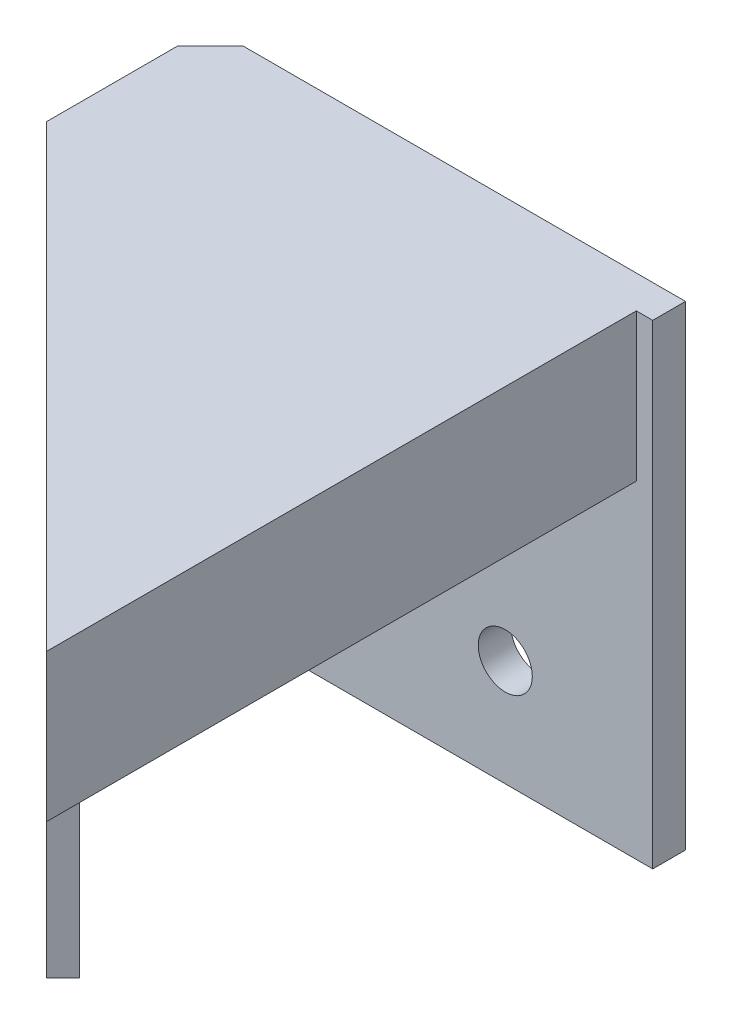
ISO-10303-21;
HEADER;
FILE_DESCRIPTION(('STEP AP214'),'2;1');
FILE_NAME('part.step','',(''),(''),'','','');
FILE_SCHEMA(('AUTOMOTIVE_DESIGN { 1 0 10303 214 1 1 1 1 }'));
ENDSEC;
DATA;
#1=APPLICATION_CONTEXT('core data for automotive mechanical design processes');
#2=APPLICATION_PROTOCOL_DEFINITION('international standard','automotive_design',2000,#1);
#3=PRODUCT_CONTEXT('',#1,'mechanical');
#4=PRODUCT('Part','Part','',(#3));
#5=PRODUCT_RELATED_PRODUCT_CATEGORY('part','',(#4));
#6=PRODUCT_DEFINITION_FORMATION('','',#4);
#7=PRODUCT_DEFINITION_CONTEXT('part definition',#1,'design');
#8=PRODUCT_DEFINITION('design','',#6,#7);
#9=PRODUCT_DEFINITION_SHAPE('','',#8);
#10=(LENGTH_UNIT() NAMED_UNIT(*) SI_UNIT(.MILLI.,.METRE.));
#11=(NAMED_UNIT(*) PLANE_ANGLE_UNIT() SI_UNIT($,.RADIAN.));
#12=(NAMED_UNIT(*) SI_UNIT($,.STERADIAN.) SOLID_ANGLE_UNIT());
#13=UNCERTAINTY_MEASURE_WITH_UNIT(LENGTH_MEASURE(1.E-05),#10,'distance_accuracy_value','');
#14=(GEOMETRIC_REPRESENTATION_CONTEXT(3) GLOBAL_UNCERTAINTY_ASSIGNED_CONTEXT((#13)) GLOBAL_UNIT_ASSIGNED_CONTEXT((#10,
#11,#12)) REPRESENTATION_CONTEXT('',''));
#15=CARTESIAN_POINT('',(0.,0.,0.));
#16=DIRECTION('',(0.,0.,1.));
#17=DIRECTION('',(1.,0.,0.));
#18=AXIS2_PLACEMENT_3D('',#15,#16,#17);
#19=CARTESIAN_POINT('',(0.,0.,0.));
#20=DIRECTION('',(0.,0.,1.));
#21=DIRECTION('',(1.,0.,0.));
#22=AXIS2_PLACEMENT_3D('',#19,#20,#21);
#23=PLANE('',#22);
#24=CARTESIAN_POINT('',(1.24992424225031,-28.95,0.));
#25=DIRECTION('',(0.,0.,1.));
#26=DIRECTION('',(1.,0.,0.));
#27=AXIS2_PLACEMENT_3D('',#24,#25,#26);
#28=CIRCLE('',#27,1.65);
#29=CARTESIAN_POINT('',(2.89992424225031,-28.95,0.));
#30=VERTEX_POINT('',#29);
#31=EDGE_CURVE('E54',#30,#30,#28,.T.);
#32=ORIENTED_EDGE('',*,*,#31,.T.);
#33=EDGE_LOOP('',(#32));
#34=FACE_BOUND('',#33,.T.);
#35=DIRECTION('',(-1.,0.,0.));
#36=VECTOR('',#35,1.);
#37=CARTESIAN_POINT('',(0.,-35.45,0.));
#38=LINE('',#37,#36);
#39=CARTESIAN_POINT('',(10.2499242422503,-35.45,0.));
#40=VERTEX_POINT('',#39);
#41=CARTESIAN_POINT('',(-16.7500757577497,-35.45,0.));
#42=VERTEX_POINT('',#41);
#43=EDGE_CURVE('E319',#40,#42,#38,.T.);
#44=ORIENTED_EDGE('',*,*,#43,.T.);
#45=DIRECTION('',(0.,1.,0.));
#46=VECTOR('',#45,1.);
#47=CARTESIAN_POINT('',(-16.7500757577497,-6.45,0.));
#48=LINE('',#47,#46);
#49=CARTESIAN_POINT('',(-16.7500757577497,-6.45,0.));
#50=VERTEX_POINT('',#49);
#51=EDGE_CURVE('E60',#42,#50,#48,.T.);
#52=ORIENTED_EDGE('',*,*,#51,.T.);
#53=DIRECTION('',(-1.,0.,0.));
#54=VECTOR('',#53,1.);
#55=CARTESIAN_POINT('',(0.,-6.45,0.));
#56=LINE('',#55,#54);
#57=CARTESIAN_POINT('',(10.2499242422503,-6.45,0.));
#58=VERTEX_POINT('',#57);
#59=EDGE_CURVE('E330',#58,#50,#56,.T.);
#60=ORIENTED_EDGE('',*,*,#59,.F.);
#61=DIRECTION('',(0.,1.,0.));
#62=VECTOR('',#61,1.);
#63=CARTESIAN_POINT('',(10.2499242422503,0.,0.));
#64=LINE('',#63,#62);
#65=EDGE_CURVE('E341',#40,#58,#64,.T.);
#66=ORIENTED_EDGE('',*,*,#65,.F.);
#67=EDGE_LOOP('',(#44,#52,#60,#66));
#68=FACE_BOUND('',#67,.T.);
#69=DIRECTION('',(0.,-1.,0.));
#70=VECTOR('',#69,1.);
#71=CARTESIAN_POINT('',(-9.85007575774969,-14.45,0.));
#72=LINE('',#71,#70);
#73=CARTESIAN_POINT('',(-9.85007575774969,-14.45,0.));
#74=VERTEX_POINT('',#73);
#75=CARTESIAN_POINT('',(-9.85007575774969,-17.35,0.));
#76=VERTEX_POINT('',#75);
#77=EDGE_CURVE('E218',#74,#76,#72,.T.);
#78=ORIENTED_EDGE('',*,*,#77,.F.);
#79=DIRECTION('',(-1.,0.,0.));
#80=VECTOR('',#79,1.);
#81=CARTESIAN_POINT('',(-14.7500757577497,-14.45,0.));
#82=LINE('',#81,#80);
#83=CARTESIAN_POINT('',(3.34992424225031,-14.45,0.));
#84=VERTEX_POINT('',#83);
#85=EDGE_CURVE('E226',#84,#74,#82,.T.);
#86=ORIENTED_EDGE('',*,*,#85,.F.);
#87=DIRECTION('',(0.,1.,0.));
#88=VECTOR('',#87,1.);
#89=CARTESIAN_POINT('',(3.34992424225031,-14.45,0.));
#90=LINE('',#89,#88);
#91=CARTESIAN_POINT('',(3.34992424225031,-17.35,0.));
#92=VERTEX_POINT('',#91);
#93=EDGE_CURVE('E484',#92,#84,#90,.T.);
#94=ORIENTED_EDGE('',*,*,#93,.F.);
#95=DIRECTION('',(-1.,0.,0.));
#96=VECTOR('',#95,1.);
#97=CARTESIAN_POINT('',(6.14992424225031,-17.35,0.));
#98=LINE('',#97,#96);
#99=CARTESIAN_POINT('',(6.14992424225031,-17.35,0.));
#100=VERTEX_POINT('',#99);
#101=EDGE_CURVE('E75',#100,#92,#98,.T.);
#102=ORIENTED_EDGE('',*,*,#101,.F.);
#103=DIRECTION('',(0.,-1.,0.));
#104=VECTOR('',#103,1.);
#105=CARTESIAN_POINT('',(6.14992424225031,-14.45,0.));
#106=LINE('',#105,#104);
#107=CARTESIAN_POINT('',(6.14992424225031,-14.45,0.));
#108=VERTEX_POINT('',#107);
#109=EDGE_CURVE('E231',#108,#100,#106,.T.);
#110=ORIENTED_EDGE('',*,*,#109,.F.);
#111=CARTESIAN_POINT('',(8.24992424225031,-14.45,0.));
#112=VERTEX_POINT('',#111);
#113=EDGE_CURVE('E239',#112,#108,#82,.T.);
#114=ORIENTED_EDGE('',*,*,#113,.F.);
#115=DIRECTION('',(0.,-1.,0.));
#116=VECTOR('',#115,1.);
#117=CARTESIAN_POINT('',(8.24992424225031,-14.45,0.));
#118=LINE('',#117,#116);
#119=CARTESIAN_POINT('',(8.24992424225031,-7.45,0.));
#120=VERTEX_POINT('',#119);
#121=EDGE_CURVE('E245',#120,#112,#118,.T.);
#122=ORIENTED_EDGE('',*,*,#121,.F.);
#123=DIRECTION('',(1.,0.,0.));
#124=VECTOR('',#123,1.);
#125=CARTESIAN_POINT('',(-14.7500757577497,-7.45,0.));
#126=LINE('',#125,#124);
#127=CARTESIAN_POINT('',(-14.7500757577497,-7.45,0.));
#128=VERTEX_POINT('',#127);
#129=EDGE_CURVE('E252',#128,#120,#126,.T.);
#130=ORIENTED_EDGE('',*,*,#129,.F.);
#131=DIRECTION('',(0.,1.,0.));
#132=VECTOR('',#131,1.);
#133=CARTESIAN_POINT('',(-14.7500757577497,-14.45,0.));
#134=LINE('',#133,#132);
#135=CARTESIAN_POINT('',(-14.7500757577497,-14.45,0.));
#136=VERTEX_POINT('',#135);
#137=EDGE_CURVE('E246',#136,#128,#134,.T.);
#138=ORIENTED_EDGE('',*,*,#137,.F.);
#139=CARTESIAN_POINT('',(-12.6500757577497,-14.45,0.));
#140=VERTEX_POINT('',#139);
#141=EDGE_CURVE('E240',#140,#136,#82,.T.);
#142=ORIENTED_EDGE('',*,*,#141,.F.);
#143=DIRECTION('',(0.,1.,0.));
#144=VECTOR('',#143,1.);
#145=CARTESIAN_POINT('',(-12.6500757577497,-14.45,0.));
#146=LINE('',#145,#144);
#147=CARTESIAN_POINT('',(-12.6500757577497,-17.35,0.));
#148=VERTEX_POINT('',#147);
#149=EDGE_CURVE('E836',#148,#140,#146,.T.);
#150=ORIENTED_EDGE('',*,*,#149,.F.);
#151=DIRECTION('',(-1.,0.,0.));
#152=VECTOR('',#151,1.);
#153=CARTESIAN_POINT('',(-9.85007575774969,-17.35,0.));
#154=LINE('',#153,#152);
#155=EDGE_CURVE('E229',#76,#148,#154,.T.);
#156=ORIENTED_EDGE('',*,*,#155,.F.);
#157=EDGE_LOOP('',(#78,#86,#94,#102,#110,#114,#122,#130,#138,#142,#150,#156));
#158=FACE_BOUND('',#157,.T.);
#159=ADVANCED_FACE('F49',(#34,#68,#158),#23,.F.);
#160=CARTESIAN_POINT('',(-2.4866197904592,17.2676497978738,26.2634559672907));
#161=DIRECTION('',(0.707106781186544,0.,0.707106781186551));
#162=DIRECTION('',(0.707106781186551,0.,-0.707106781186544));
#163=AXIS2_PLACEMENT_3D('',#160,#161,#162);
#164=PLANE('',#163);
#165=DIRECTION('',(0.707106781186551,0.,-0.707106781186544));
#166=VECTOR('',#165,1.);
#167=CARTESIAN_POINT('',(-2.48661979045919,-15.45,26.2634559672907));
#168=LINE('',#167,#166);
#169=CARTESIAN_POINT('',(-2.48661979045919,-15.45,26.2634559672907));
#170=VERTEX_POINT('',#169);
#171=CARTESIAN_POINT('',(-1.48661979045918,-15.45,25.2634559672907));
#172=VERTEX_POINT('',#171);
#173=EDGE_CURVE('E436',#170,#172,#168,.T.);
#174=ORIENTED_EDGE('',*,*,#173,.F.);
#175=DIRECTION('',(0.,-1.,0.));
#176=VECTOR('',#175,1.);
#177=CARTESIAN_POINT('',(-2.4866197904592,17.2676497978738,26.2634559672907));
#178=LINE('',#177,#176);
#179=CARTESIAN_POINT('',(-2.48661979045919,-35.45,26.2634559672907));
#180=VERTEX_POINT('',#179);
#181=EDGE_CURVE('E291',#170,#180,#178,.T.);
#182=ORIENTED_EDGE('',*,*,#181,.T.);
#183=DIRECTION('',(-0.707106781186551,0.,0.707106781186544));
#184=VECTOR('',#183,1.);
#185=CARTESIAN_POINT('',(-2.48661979045919,-35.45,26.2634559672907));
#186=LINE('',#185,#184);
#187=CARTESIAN_POINT('',(-1.48661979045918,-35.45,25.2634559672907));
#188=VERTEX_POINT('',#187);
#189=EDGE_CURVE('E295',#188,#180,#186,.T.);
#190=ORIENTED_EDGE('',*,*,#189,.F.);
#191=DIRECTION('',(0.,-1.,0.));
#192=VECTOR('',#191,1.);
#193=CARTESIAN_POINT('',(-1.48661979045918,17.2676497978738,25.2634559672907));
#194=LINE('',#193,#192);
#195=EDGE_CURVE('E303',#172,#188,#194,.T.);
#196=ORIENTED_EDGE('',*,*,#195,.F.);
#197=EDGE_LOOP('',(#174,#182,#190,#196));
#198=FACE_BOUND('',#197,.T.);
#199=ADVANCED_FACE('F518',(#198),#164,.T.);
#200=CARTESIAN_POINT('',(0.,-35.45,2.));
#201=DIRECTION('',(0.,-1.,0.));
#202=DIRECTION('',(0.,0.,-1.));
#203=AXIS2_PLACEMENT_3D('',#200,#201,#202);
#204=PLANE('',#203);
#205=DIRECTION('',(0.,0.,1.));
#206=VECTOR('',#205,1.);
#207=CARTESIAN_POINT('',(-18.7500757577497,-35.45,0.));
#208=LINE('',#207,#206);
#209=CARTESIAN_POINT('',(-18.7500757577497,-35.45,2.));
#210=VERTEX_POINT('',#209);
#211=CARTESIAN_POINT('',(-18.7500757577497,-35.45,10.));
#212=VERTEX_POINT('',#211);
#213=EDGE_CURVE('E308',#210,#212,#208,.T.);
#214=ORIENTED_EDGE('',*,*,#213,.F.);
#215=DIRECTION('',(0.707106781186548,0.,-0.707106781186548));
#216=VECTOR('',#215,1.);
#217=CARTESIAN_POINT('',(-9.37503787887485,-35.45,-7.37503787887485));
#218=LINE('',#217,#216);
#219=EDGE_CURVE('E371',#210,#42,#218,.T.);
#220=ORIENTED_EDGE('',*,*,#219,.T.);
#221=ORIENTED_EDGE('',*,*,#43,.F.);
#222=DIRECTION('',(0.,0.,-1.));
#223=VECTOR('',#222,1.);
#224=CARTESIAN_POINT('',(10.2499242422503,-35.45,2.));
#225=LINE('',#224,#223);
#226=CARTESIAN_POINT('',(10.2499242422503,-35.45,2.));
#227=VERTEX_POINT('',#226);
#228=EDGE_CURVE('E350',#227,#40,#225,.T.);
#229=ORIENTED_EDGE('',*,*,#228,.F.);
#230=DIRECTION('',(-1.,0.,0.));
#231=VECTOR('',#230,1.);
#232=CARTESIAN_POINT('',(0.,-35.45,2.));
#233=LINE('',#232,#231);
#234=CARTESIAN_POINT('',(-15.7500757577497,-35.45,2.));
#235=VERTEX_POINT('',#234);
#236=EDGE_CURVE('E325',#227,#235,#233,.T.);
#237=ORIENTED_EDGE('',*,*,#236,.T.);
#238=DIRECTION('',(-0.707106781186543,0.,0.707106781186552));
#239=VECTOR('',#238,1.);
#240=CARTESIAN_POINT('',(-16.7500757577497,-35.45,3.));
#241=LINE('',#240,#239);
#242=CARTESIAN_POINT('',(-16.7500757577497,-35.45,3.));
#243=VERTEX_POINT('',#242);
#244=EDGE_CURVE('E360',#235,#243,#241,.T.);
#245=ORIENTED_EDGE('',*,*,#244,.T.);
#246=DIRECTION('',(0.,0.,1.));
#247=VECTOR('',#246,1.);
#248=CARTESIAN_POINT('',(-16.7500757577497,-35.45,0.));
#249=LINE('',#248,#247);
#250=CARTESIAN_POINT('',(-16.7500757577497,-35.45,10.));
#251=VERTEX_POINT('',#250);
#252=EDGE_CURVE('E290',#243,#251,#249,.T.);
#253=ORIENTED_EDGE('',*,*,#252,.T.);
#254=DIRECTION('',(0.707106781186544,0.,0.707106781186551));
#255=VECTOR('',#254,1.);
#256=CARTESIAN_POINT('',(-1.48661979045918,-35.45,25.2634559672907));
#257=LINE('',#256,#255);
#258=EDGE_CURVE('E286',#251,#188,#257,.T.);
#259=ORIENTED_EDGE('',*,*,#258,.T.);
#260=ORIENTED_EDGE('',*,*,#189,.T.);
#261=DIRECTION('',(-0.707106781186544,0.,-0.707106781186551));
#262=VECTOR('',#261,1.);
#263=CARTESIAN_POINT('',(-18.7500757577497,-35.45,10.));
#264=LINE('',#263,#262);
#265=EDGE_CURVE('E299',#180,#212,#264,.T.);
#266=ORIENTED_EDGE('',*,*,#265,.T.);
#267=EDGE_LOOP('',(#214,#220,#221,#229,#237,#245,#253,#259,#260,#266));
#268=FACE_BOUND('',#267,.T.);
#269=ADVANCED_FACE('F393',(#268),#204,.T.);
#270=CARTESIAN_POINT('',(10.2499242422503,0.,2.));
#271=DIRECTION('',(-1.,0.,0.));
#272=DIRECTION('',(0.,0.,1.));
#273=AXIS2_PLACEMENT_3D('',#270,#271,#272);
#274=PLANE('',#273);
#275=ORIENTED_EDGE('',*,*,#65,.T.);
#276=DIRECTION('',(0.,0.,-1.));
#277=VECTOR('',#276,1.);
#278=CARTESIAN_POINT('',(10.2499242422503,-6.45,2.));
#279=LINE('',#278,#277);
#280=CARTESIAN_POINT('',(10.2499242422503,-6.45,2.));
#281=VERTEX_POINT('',#280);
#282=EDGE_CURVE('E337',#281,#58,#279,.T.);
#283=ORIENTED_EDGE('',*,*,#282,.F.);
#284=DIRECTION('',(0.,1.,0.));
#285=VECTOR('',#284,1.);
#286=CARTESIAN_POINT('',(10.2499242422503,0.,2.));
#287=LINE('',#286,#285);
#288=EDGE_CURVE('E329',#227,#281,#287,.T.);
#289=ORIENTED_EDGE('',*,*,#288,.F.);
#290=ORIENTED_EDGE('',*,*,#228,.T.);
#291=EDGE_LOOP('',(#275,#283,#289,#290));
#292=FACE_BOUND('',#291,.T.);
#293=ADVANCED_FACE('F532',(#292),#274,.F.);
#294=CARTESIAN_POINT('',(0.,-6.45,2.));
#295=DIRECTION('',(0.,-1.,0.));
#296=DIRECTION('',(1.,0.,0.));
#297=AXIS2_PLACEMENT_3D('',#294,#295,#296);
#298=PLANE('',#297);
#299=ORIENTED_EDGE('',*,*,#59,.T.);
#300=DIRECTION('',(-0.707106781186548,0.,0.707106781186548));
#301=VECTOR('',#300,1.);
#302=CARTESIAN_POINT('',(-18.7500757577497,-6.45,2.));
#303=LINE('',#302,#301);
#304=CARTESIAN_POINT('',(-18.7500757577497,-6.45,2.));
#305=VERTEX_POINT('',#304);
#306=EDGE_CURVE('E11',#50,#305,#303,.T.);
#307=ORIENTED_EDGE('',*,*,#306,.T.);
#308=DIRECTION('',(0.,0.,-1.));
#309=VECTOR('',#308,1.);
#310=CARTESIAN_POINT('',(-18.7500757577497,-6.45,0.));
#311=LINE('',#310,#309);
#312=CARTESIAN_POINT('',(-18.7500757577497,-6.45,10.));
#313=VERTEX_POINT('',#312);
#314=EDGE_CURVE('E315',#313,#305,#311,.T.);
#315=ORIENTED_EDGE('',*,*,#314,.F.);
#316=DIRECTION('',(0.707106781186544,0.,0.707106781186551));
#317=VECTOR('',#316,1.);
#318=CARTESIAN_POINT('',(-18.7500757577497,-6.45,10.));
#319=LINE('',#318,#317);
#320=CARTESIAN_POINT('',(9.24992424225031,-6.45,38.0000000000003));
#321=VERTEX_POINT('',#320);
#322=EDGE_CURVE('E287',#313,#321,#319,.T.);
#323=ORIENTED_EDGE('',*,*,#322,.T.);
#324=DIRECTION('',(0.,0.,-1.));
#325=VECTOR('',#324,1.);
#326=CARTESIAN_POINT('',(9.24992424225031,-6.45,59.5020755129384));
#327=LINE('',#326,#325);
#328=CARTESIAN_POINT('',(9.24992424225031,-6.45,2.));
#329=VERTEX_POINT('',#328);
#330=EDGE_CURVE('E404',#321,#329,#327,.T.);
#331=ORIENTED_EDGE('',*,*,#330,.T.);
#332=DIRECTION('',(-1.,0.,0.));
#333=VECTOR('',#332,1.);
#334=CARTESIAN_POINT('',(0.,-6.45,2.));
#335=LINE('',#334,#333);
#336=EDGE_CURVE('E333',#281,#329,#335,.T.);
#337=ORIENTED_EDGE('',*,*,#336,.F.);
#338=ORIENTED_EDGE('',*,*,#282,.T.);
#339=EDGE_LOOP('',(#299,#307,#315,#323,#331,#337,#338));
#340=FACE_BOUND('',#339,.T.);
#341=ADVANCED_FACE('F383',(#340),#298,.F.);
#342=CARTESIAN_POINT('',(0.,0.,2.));
#343=DIRECTION('',(0.,0.,1.));
#344=DIRECTION('',(1.,0.,0.));
#345=AXIS2_PLACEMENT_3D('',#342,#343,#344);
#346=PLANE('',#345);
#347=CARTESIAN_POINT('',(1.24992424225031,-28.95,2.));
#348=DIRECTION('',(0.,0.,1.));
#349=DIRECTION('',(1.,0.,0.));
#350=AXIS2_PLACEMENT_3D('',#347,#348,#349);
#351=CIRCLE('',#350,1.65);
#352=CARTESIAN_POINT('',(2.89992424225031,-28.95,2.));
#353=VERTEX_POINT('',#352);
#354=EDGE_CURVE('E493',#353,#353,#351,.T.);
#355=ORIENTED_EDGE('',*,*,#354,.F.);
#356=EDGE_LOOP('',(#355));
#357=FACE_BOUND('',#356,.T.);
#358=DIRECTION('',(1.,0.,0.));
#359=VECTOR('',#358,1.);
#360=CARTESIAN_POINT('',(0.,-15.45,2.));
#361=LINE('',#360,#359);
#362=CARTESIAN_POINT('',(-15.7500757577497,-15.45,2.));
#363=VERTEX_POINT('',#362);
#364=CARTESIAN_POINT('',(9.24992424225031,-15.45,2.));
#365=VERTEX_POINT('',#364);
#366=EDGE_CURVE('E430',#363,#365,#361,.T.);
#367=ORIENTED_EDGE('',*,*,#366,.F.);
#368=DIRECTION('',(0.,-1.,0.));
#369=VECTOR('',#368,1.);
#370=CARTESIAN_POINT('',(-15.7500757577497,0.,2.));
#371=LINE('',#370,#369);
#372=EDGE_CURVE('E357',#363,#235,#371,.T.);
#373=ORIENTED_EDGE('',*,*,#372,.T.);
#374=ORIENTED_EDGE('',*,*,#236,.F.);
#375=ORIENTED_EDGE('',*,*,#288,.T.);
#376=ORIENTED_EDGE('',*,*,#336,.T.);
#377=DIRECTION('',(0.,1.,0.));
#378=VECTOR('',#377,1.);
#379=CARTESIAN_POINT('',(9.24992424225031,0.,2.));
#380=LINE('',#379,#378);
#381=EDGE_CURVE('E416',#365,#329,#380,.T.);
#382=ORIENTED_EDGE('',*,*,#381,.F.);
#383=EDGE_LOOP('',(#367,#373,#374,#375,#376,#382));
#384=FACE_BOUND('',#383,.T.);
#385=ADVANCED_FACE('F528',(#357,#384),#346,.T.);
#386=CARTESIAN_POINT('',(-16.7500757577497,0.,0.));
#387=DIRECTION('',(-1.,0.,0.));
#388=DIRECTION('',(0.,0.,1.));
#389=AXIS2_PLACEMENT_3D('',#386,#387,#388);
#390=PLANE('',#389);
#391=DIRECTION('',(0.,1.,0.));
#392=VECTOR('',#391,1.);
#393=CARTESIAN_POINT('',(-16.7500757577497,0.,3.));
#394=LINE('',#393,#392);
#395=CARTESIAN_POINT('',(-16.7500757577497,-15.45,3.));
#396=VERTEX_POINT('',#395);
#397=EDGE_CURVE('E353',#243,#396,#394,.T.);
#398=ORIENTED_EDGE('',*,*,#397,.T.);
#399=DIRECTION('',(0.,0.,1.));
#400=VECTOR('',#399,1.);
#401=CARTESIAN_POINT('',(-16.7500757577497,-15.45,0.));
#402=LINE('',#401,#400);
#403=CARTESIAN_POINT('',(-16.7500757577497,-15.45,10.));
#404=VERTEX_POINT('',#403);
#405=EDGE_CURVE('E423',#396,#404,#402,.T.);
#406=ORIENTED_EDGE('',*,*,#405,.T.);
#407=DIRECTION('',(0.,1.,0.));
#408=VECTOR('',#407,1.);
#409=CARTESIAN_POINT('',(-16.7500757577497,-6.45,10.));
#410=LINE('',#409,#408);
#411=EDGE_CURVE('E312',#251,#404,#410,.T.);
#412=ORIENTED_EDGE('',*,*,#411,.F.);
#413=ORIENTED_EDGE('',*,*,#252,.F.);
#414=EDGE_LOOP('',(#398,#406,#412,#413));
#415=FACE_BOUND('',#414,.T.);
#416=ADVANCED_FACE('F564',(#415),#390,.F.);
#417=CARTESIAN_POINT('',(-18.7500757577497,0.,0.));
#418=DIRECTION('',(-1.,0.,0.));
#419=DIRECTION('',(0.,0.,1.));
#420=AXIS2_PLACEMENT_3D('',#417,#418,#419);
#421=PLANE('',#420);
#422=ORIENTED_EDGE('',*,*,#314,.T.);
#423=DIRECTION('',(0.,-1.,0.));
#424=VECTOR('',#423,1.);
#425=CARTESIAN_POINT('',(-18.7500757577497,-35.45,2.));
#426=LINE('',#425,#424);
#427=EDGE_CURVE('E367',#305,#210,#426,.T.);
#428=ORIENTED_EDGE('',*,*,#427,.T.);
#429=ORIENTED_EDGE('',*,*,#213,.T.);
#430=DIRECTION('',(0.,1.,0.));
#431=VECTOR('',#430,1.);
#432=CARTESIAN_POINT('',(-18.7500757577497,-6.45,10.));
#433=LINE('',#432,#431);
#434=EDGE_CURVE('E311',#212,#313,#433,.T.);
#435=ORIENTED_EDGE('',*,*,#434,.T.);
#436=EDGE_LOOP('',(#422,#428,#429,#435));
#437=FACE_BOUND('',#436,.T.);
#438=ADVANCED_FACE('F390',(#437),#421,.T.);
#439=CARTESIAN_POINT('',(-18.7500757577497,17.2676497978738,10.));
#440=DIRECTION('',(-0.707106781186551,0.,0.707106781186544));
#441=DIRECTION('',(0.707106781186544,0.,0.707106781186551));
#442=AXIS2_PLACEMENT_3D('',#439,#440,#441);
#443=PLANE('',#442);
#444=ORIENTED_EDGE('',*,*,#181,.F.);
#445=DIRECTION('',(-0.707106781186544,0.,-0.707106781186551));
#446=VECTOR('',#445,1.);
#447=CARTESIAN_POINT('',(20.0009619987194,-15.45,48.7510377564695));
#448=LINE('',#447,#446);
#449=CARTESIAN_POINT('',(9.24992424225031,-15.45,38.0000000000003));
#450=VERTEX_POINT('',#449);
#451=EDGE_CURVE('E407',#450,#170,#448,.T.);
#452=ORIENTED_EDGE('',*,*,#451,.F.);
#453=DIRECTION('',(0.,-1.,0.));
#454=VECTOR('',#453,1.);
#455=CARTESIAN_POINT('',(9.24992424225031,-15.45,38.0000000000003));
#456=LINE('',#455,#454);
#457=EDGE_CURVE('E406',#321,#450,#456,.T.);
#458=ORIENTED_EDGE('',*,*,#457,.F.);
#459=ORIENTED_EDGE('',*,*,#322,.F.);
#460=ORIENTED_EDGE('',*,*,#434,.F.);
#461=ORIENTED_EDGE('',*,*,#265,.F.);
#462=EDGE_LOOP('',(#444,#452,#458,#459,#460,#461));
#463=FACE_BOUND('',#462,.T.);
#464=DIRECTION('',(0.,-1.,0.));
#465=VECTOR('',#464,1.);
#466=CARTESIAN_POINT('',(8.24992424225031,-14.45,37.0000000000003));
#467=LINE('',#466,#465);
#468=CARTESIAN_POINT('',(8.24992424225031,-7.45,37.0000000000003));
#469=VERTEX_POINT('',#468);
#470=CARTESIAN_POINT('',(8.24992424225031,-14.45,37.0000000000003));
#471=VERTEX_POINT('',#470);
#472=EDGE_CURVE('E418',#469,#471,#467,.T.);
#473=ORIENTED_EDGE('',*,*,#472,.T.);
#474=DIRECTION('',(0.707106781186544,0.,0.707106781186551));
#475=VECTOR('',#474,1.);
#476=CARTESIAN_POINT('',(5.51033188233606,-14.45,34.260407640086));
#477=LINE('',#476,#475);
#478=CARTESIAN_POINT('',(-14.7500757577497,-14.45,14.0000000000001));
#479=VERTEX_POINT('',#478);
#480=EDGE_CURVE('E441',#479,#471,#477,.T.);
#481=ORIENTED_EDGE('',*,*,#480,.F.);
#482=DIRECTION('',(0.,-1.,0.));
#483=VECTOR('',#482,1.);
#484=CARTESIAN_POINT('',(-14.7500757577497,-14.45,14.0000000000001));
#485=LINE('',#484,#483);
#486=CARTESIAN_POINT('',(-14.7500757577497,-7.45,14.0000000000001));
#487=VERTEX_POINT('',#486);
#488=EDGE_CURVE('E267',#487,#479,#485,.T.);
#489=ORIENTED_EDGE('',*,*,#488,.F.);
#490=DIRECTION('',(-0.707106781186544,0.,-0.707106781186551));
#491=VECTOR('',#490,1.);
#492=CARTESIAN_POINT('',(5.51033188233606,-7.45,34.260407640086));
#493=LINE('',#492,#491);
#494=EDGE_CURVE('E445',#469,#487,#493,.T.);
#495=ORIENTED_EDGE('',*,*,#494,.F.);
#496=EDGE_LOOP('',(#473,#481,#489,#495));
#497=FACE_BOUND('',#496,.T.);
#498=CARTESIAN_POINT('',(-6.02215369639191,-18.45,22.7279220613579));
#499=DIRECTION('',(-0.707106781186551,0.,0.707106781186544));
#500=DIRECTION('',(0.707106781186544,0.,0.707106781186551));
#501=AXIS2_PLACEMENT_3D('',#498,#499,#500);
#502=CIRCLE('',#501,1.65);
#503=CARTESIAN_POINT('',(-4.85542750743411,-18.45,23.8946482503157));
#504=VERTEX_POINT('',#503);
#505=EDGE_CURVE('E282',#504,#504,#502,.T.);
#506=ORIENTED_EDGE('',*,*,#505,.F.);
#507=EDGE_LOOP('',(#506));
#508=FACE_BOUND('',#507,.T.);
#509=CARTESIAN_POINT('',(-6.02215369639191,-32.45,22.7279220613579));
#510=DIRECTION('',(-0.707106781186551,0.,0.707106781186544));
#511=DIRECTION('',(0.707106781186544,0.,0.707106781186551));
#512=AXIS2_PLACEMENT_3D('',#509,#510,#511);
#513=CIRCLE('',#512,1.65);
#514=CARTESIAN_POINT('',(-4.85542750743411,-32.45,23.8946482503157));
#515=VERTEX_POINT('',#514);
#516=EDGE_CURVE('E275',#515,#515,#513,.T.);
#517=ORIENTED_EDGE('',*,*,#516,.F.);
#518=EDGE_LOOP('',(#517));
#519=FACE_BOUND('',#518,.T.);
#520=ADVANCED_FACE('F398',(#463,#497,#508,#519),#443,.T.);
#521=CARTESIAN_POINT('',(-1.48661979045918,17.2676497978738,25.2634559672907));
#522=DIRECTION('',(0.707106781186551,0.,-0.707106781186544));
#523=DIRECTION('',(-0.707106781186544,0.,-0.707106781186551));
#524=AXIS2_PLACEMENT_3D('',#521,#522,#523);
#525=PLANE('',#524);
#526=DIRECTION('',(-0.707106781186544,0.,-0.707106781186551));
#527=VECTOR('',#526,1.);
#528=CARTESIAN_POINT('',(-1.48661979045918,-15.45,25.2634559672907));
#529=LINE('',#528,#527);
#530=EDGE_CURVE('E433',#172,#404,#529,.T.);
#531=ORIENTED_EDGE('',*,*,#530,.F.);
#532=ORIENTED_EDGE('',*,*,#195,.T.);
#533=ORIENTED_EDGE('',*,*,#258,.F.);
#534=ORIENTED_EDGE('',*,*,#411,.T.);
#535=EDGE_LOOP('',(#531,#532,#533,#534));
#536=FACE_BOUND('',#535,.T.);
#537=CARTESIAN_POINT('',(-5.02215369639191,-18.45,21.7279220613579));
#538=DIRECTION('',(0.707106781186552,0.,-0.707106781186543));
#539=DIRECTION('',(-0.707106781186543,0.,-0.707106781186552));
#540=AXIS2_PLACEMENT_3D('',#537,#538,#539);
#541=CIRCLE('',#540,1.65);
#542=CARTESIAN_POINT('',(-6.18887988534971,-18.45,20.5611958724001));
#543=VERTEX_POINT('',#542);
#544=EDGE_CURVE('E271',#543,#543,#541,.T.);
#545=ORIENTED_EDGE('',*,*,#544,.F.);
#546=EDGE_LOOP('',(#545));
#547=FACE_BOUND('',#546,.T.);
#548=CARTESIAN_POINT('',(-5.02215369639191,-32.45,21.7279220613579));
#549=DIRECTION('',(0.707106781186552,0.,-0.707106781186543));
#550=DIRECTION('',(-0.707106781186543,0.,-0.707106781186552));
#551=AXIS2_PLACEMENT_3D('',#548,#549,#550);
#552=CIRCLE('',#551,1.65);
#553=CARTESIAN_POINT('',(-6.1888798853497,-32.45,20.5611958724001));
#554=VERTEX_POINT('',#553);
#555=EDGE_CURVE('E270',#554,#554,#552,.T.);
#556=ORIENTED_EDGE('',*,*,#555,.F.);
#557=EDGE_LOOP('',(#556));
#558=FACE_BOUND('',#557,.T.);
#559=ADVANCED_FACE('F568',(#536,#547,#558),#525,.T.);
#560=CARTESIAN_POINT('',(-6.43636725876501,-32.45,23.142135623731));
#561=DIRECTION('',(0.707106781186552,0.,-0.707106781186543));
#562=DIRECTION('',(-0.707106781186543,0.,-0.707106781186552));
#563=AXIS2_PLACEMENT_3D('',#560,#561,#562);
#564=CYLINDRICAL_SURFACE('',#563,1.65);
#565=ORIENTED_EDGE('',*,*,#516,.T.);
#566=EDGE_LOOP('',(#565));
#567=FACE_BOUND('',#566,.T.);
#568=ORIENTED_EDGE('',*,*,#555,.T.);
#569=EDGE_LOOP('',(#568));
#570=FACE_BOUND('',#569,.T.);
#571=ADVANCED_FACE('F551',(#567,#570),#564,.F.);
#572=CARTESIAN_POINT('',(-6.43636725876501,-18.45,23.142135623731));
#573=DIRECTION('',(0.707106781186552,0.,-0.707106781186543));
#574=DIRECTION('',(-0.707106781186543,0.,-0.707106781186552));
#575=AXIS2_PLACEMENT_3D('',#572,#573,#574);
#576=CYLINDRICAL_SURFACE('',#575,1.65);
#577=ORIENTED_EDGE('',*,*,#505,.T.);
#578=EDGE_LOOP('',(#577));
#579=FACE_BOUND('',#578,.T.);
#580=ORIENTED_EDGE('',*,*,#544,.T.);
#581=EDGE_LOOP('',(#580));
#582=FACE_BOUND('',#581,.T.);
#583=ADVANCED_FACE('F542',(#579,#582),#576,.F.);
#584=CARTESIAN_POINT('',(-16.7500757577497,0.,3.));
#585=DIRECTION('',(-0.707106781186552,0.,-0.707106781186543));
#586=DIRECTION('',(0.,1.,0.));
#587=AXIS2_PLACEMENT_3D('',#584,#585,#586);
#588=PLANE('',#587);
#589=ORIENTED_EDGE('',*,*,#372,.F.);
#590=DIRECTION('',(-0.707106781186543,0.,0.707106781186552));
#591=VECTOR('',#590,1.);
#592=CARTESIAN_POINT('',(-16.7500757577497,-15.45,3.));
#593=LINE('',#592,#591);
#594=EDGE_CURVE('E363',#363,#396,#593,.T.);
#595=ORIENTED_EDGE('',*,*,#594,.T.);
#596=ORIENTED_EDGE('',*,*,#397,.F.);
#597=ORIENTED_EDGE('',*,*,#244,.F.);
#598=EDGE_LOOP('',(#589,#595,#596,#597));
#599=FACE_BOUND('',#598,.T.);
#600=ADVANCED_FACE('F538',(#599),#588,.F.);
#601=CARTESIAN_POINT('',(-14.7500757577497,-14.45,-24.0416305603426));
#602=DIRECTION('',(0.,-1.,0.));
#603=DIRECTION('',(0.,0.,-1.));
#604=AXIS2_PLACEMENT_3D('',#601,#602,#603);
#605=PLANE('',#604);
#606=DIRECTION('',(0.,0.,1.));
#607=VECTOR('',#606,1.);
#608=CARTESIAN_POINT('',(-14.7500757577497,-14.45,-24.0416305603426));
#609=LINE('',#608,#607);
#610=EDGE_CURVE('E257',#136,#479,#609,.T.);
#611=ORIENTED_EDGE('',*,*,#610,.T.);
#612=ORIENTED_EDGE('',*,*,#480,.T.);
#613=DIRECTION('',(0.,0.,1.));
#614=VECTOR('',#613,1.);
#615=CARTESIAN_POINT('',(8.24992424225031,-14.45,-24.0416305603426));
#616=LINE('',#615,#614);
#617=EDGE_CURVE('E253',#112,#471,#616,.T.);
#618=ORIENTED_EDGE('',*,*,#617,.F.);
#619=ORIENTED_EDGE('',*,*,#113,.T.);
#620=DIRECTION('',(0.,0.,1.));
#621=VECTOR('',#620,1.);
#622=CARTESIAN_POINT('',(6.14992424225031,-14.45,-3.));
#623=LINE('',#622,#621);
#624=CARTESIAN_POINT('',(6.14992424225031,-14.45,-3.));
#625=VERTEX_POINT('',#624);
#626=EDGE_CURVE('E467',#625,#108,#623,.T.);
#627=ORIENTED_EDGE('',*,*,#626,.F.);
#628=DIRECTION('',(1.,0.,0.));
#629=VECTOR('',#628,1.);
#630=CARTESIAN_POINT('',(6.14992424225031,-14.45,-3.));
#631=LINE('',#630,#629);
#632=CARTESIAN_POINT('',(3.34992424225031,-14.45,-3.));
#633=VERTEX_POINT('',#632);
#634=EDGE_CURVE('E475',#633,#625,#631,.T.);
#635=ORIENTED_EDGE('',*,*,#634,.F.);
#636=DIRECTION('',(0.,0.,1.));
#637=VECTOR('',#636,1.);
#638=CARTESIAN_POINT('',(3.34992424225031,-14.45,-3.));
#639=LINE('',#638,#637);
#640=EDGE_CURVE('E237',#633,#84,#639,.T.);
#641=ORIENTED_EDGE('',*,*,#640,.T.);
#642=ORIENTED_EDGE('',*,*,#85,.T.);
#643=DIRECTION('',(0.,0.,1.));
#644=VECTOR('',#643,1.);
#645=CARTESIAN_POINT('',(-9.85007575774969,-14.45,-3.));
#646=LINE('',#645,#644);
#647=CARTESIAN_POINT('',(-9.85007575774969,-14.45,-3.));
#648=VERTEX_POINT('',#647);
#649=EDGE_CURVE('E214',#648,#74,#646,.T.);
#650=ORIENTED_EDGE('',*,*,#649,.F.);
#651=DIRECTION('',(1.,0.,0.));
#652=VECTOR('',#651,1.);
#653=CARTESIAN_POINT('',(-9.85007575774969,-14.45,-3.));
#654=LINE('',#653,#652);
#655=CARTESIAN_POINT('',(-12.6500757577497,-14.45,-3.));
#656=VERTEX_POINT('',#655);
#657=EDGE_CURVE('E224',#656,#648,#654,.T.);
#658=ORIENTED_EDGE('',*,*,#657,.F.);
#659=DIRECTION('',(0.,0.,1.));
#660=VECTOR('',#659,1.);
#661=CARTESIAN_POINT('',(-12.6500757577497,-14.45,-3.));
#662=LINE('',#661,#660);
#663=EDGE_CURVE('E67',#656,#140,#662,.T.);
#664=ORIENTED_EDGE('',*,*,#663,.T.);
#665=ORIENTED_EDGE('',*,*,#141,.T.);
#666=EDGE_LOOP('',(#611,#612,#618,#619,#627,#635,#641,#642,#650,#658,#664,#665));
#667=FACE_BOUND('',#666,.T.);
#668=ADVANCED_FACE('F234',(#667),#605,.F.);
#669=CARTESIAN_POINT('',(-14.7500757577497,-14.45,-24.0416305603426));
#670=DIRECTION('',(-1.,0.,0.));
#671=DIRECTION('',(0.,0.,1.));
#672=AXIS2_PLACEMENT_3D('',#669,#670,#671);
#673=PLANE('',#672);
#674=DIRECTION('',(0.,0.,1.));
#675=VECTOR('',#674,1.);
#676=CARTESIAN_POINT('',(-14.7500757577497,-7.45,-24.0416305603426));
#677=LINE('',#676,#675);
#678=EDGE_CURVE('E260',#128,#487,#677,.T.);
#679=ORIENTED_EDGE('',*,*,#678,.T.);
#680=ORIENTED_EDGE('',*,*,#488,.T.);
#681=ORIENTED_EDGE('',*,*,#610,.F.);
#682=ORIENTED_EDGE('',*,*,#137,.T.);
#683=EDGE_LOOP('',(#679,#680,#681,#682));
#684=FACE_BOUND('',#683,.T.);
#685=ADVANCED_FACE('F548',(#684),#673,.F.);
#686=CARTESIAN_POINT('',(-14.7500757577497,-7.45,-24.0416305603426));
#687=DIRECTION('',(0.,1.,0.));
#688=DIRECTION('',(0.,0.,1.));
#689=AXIS2_PLACEMENT_3D('',#686,#687,#688);
#690=PLANE('',#689);
#691=DIRECTION('',(0.,0.,1.));
#692=VECTOR('',#691,1.);
#693=CARTESIAN_POINT('',(8.24992424225031,-7.45,-24.0416305603426));
#694=LINE('',#693,#692);
#695=EDGE_CURVE('E263',#120,#469,#694,.T.);
#696=ORIENTED_EDGE('',*,*,#695,.T.);
#697=ORIENTED_EDGE('',*,*,#494,.T.);
#698=ORIENTED_EDGE('',*,*,#678,.F.);
#699=ORIENTED_EDGE('',*,*,#129,.T.);
#700=EDGE_LOOP('',(#696,#697,#698,#699));
#701=FACE_BOUND('',#700,.T.);
#702=ADVANCED_FACE('F461',(#701),#690,.F.);
#703=CARTESIAN_POINT('',(8.24992424225031,-14.45,-24.0416305603426));
#704=DIRECTION('',(1.,0.,0.));
#705=DIRECTION('',(0.,1.,0.));
#706=AXIS2_PLACEMENT_3D('',#703,#704,#705);
#707=PLANE('',#706);
#708=ORIENTED_EDGE('',*,*,#617,.T.);
#709=ORIENTED_EDGE('',*,*,#472,.F.);
#710=ORIENTED_EDGE('',*,*,#695,.F.);
#711=ORIENTED_EDGE('',*,*,#121,.T.);
#712=EDGE_LOOP('',(#708,#709,#710,#711));
#713=FACE_BOUND('',#712,.T.);
#714=ADVANCED_FACE('F456',(#713),#707,.F.);
#715=CARTESIAN_POINT('',(9.24992424225031,-15.45,59.5020755129384));
#716=DIRECTION('',(0.,-1.,0.));
#717=DIRECTION('',(0.,0.,-1.));
#718=AXIS2_PLACEMENT_3D('',#715,#716,#717);
#719=PLANE('',#718);
#720=ORIENTED_EDGE('',*,*,#451,.T.);
#721=ORIENTED_EDGE('',*,*,#173,.T.);
#722=ORIENTED_EDGE('',*,*,#530,.T.);
#723=ORIENTED_EDGE('',*,*,#405,.F.);
#724=ORIENTED_EDGE('',*,*,#594,.F.);
#725=ORIENTED_EDGE('',*,*,#366,.T.);
#726=DIRECTION('',(0.,0.,-1.));
#727=VECTOR('',#726,1.);
#728=CARTESIAN_POINT('',(9.24992424225031,-15.45,59.5020755129384));
#729=LINE('',#728,#727);
#730=EDGE_CURVE('E412',#450,#365,#729,.T.);
#731=ORIENTED_EDGE('',*,*,#730,.F.);
#732=EDGE_LOOP('',(#720,#721,#722,#723,#724,#725,#731));
#733=FACE_BOUND('',#732,.T.);
#734=ADVANCED_FACE('F571',(#733),#719,.T.);
#735=CARTESIAN_POINT('',(9.24992424225031,-15.45,59.5020755129384));
#736=DIRECTION('',(1.,0.,0.));
#737=DIRECTION('',(0.,0.,-1.));
#738=AXIS2_PLACEMENT_3D('',#735,#736,#737);
#739=PLANE('',#738);
#740=ORIENTED_EDGE('',*,*,#730,.T.);
#741=ORIENTED_EDGE('',*,*,#381,.T.);
#742=ORIENTED_EDGE('',*,*,#330,.F.);
#743=ORIENTED_EDGE('',*,*,#457,.T.);
#744=EDGE_LOOP('',(#740,#741,#742,#743));
#745=FACE_BOUND('',#744,.T.);
#746=ADVANCED_FACE('F414',(#745),#739,.T.);
#747=CARTESIAN_POINT('',(-18.7500757577497,0.,2.));
#748=DIRECTION('',(-0.707106781186547,0.,-0.707106781186547));
#749=DIRECTION('',(0.,1.,0.));
#750=AXIS2_PLACEMENT_3D('',#747,#748,#749);
#751=PLANE('',#750);
#752=ORIENTED_EDGE('',*,*,#306,.F.);
#753=ORIENTED_EDGE('',*,*,#51,.F.);
#754=ORIENTED_EDGE('',*,*,#219,.F.);
#755=ORIENTED_EDGE('',*,*,#427,.F.);
#756=EDGE_LOOP('',(#752,#753,#754,#755));
#757=FACE_BOUND('',#756,.T.);
#758=ADVANCED_FACE('F52',(#757),#751,.T.);
#759=CARTESIAN_POINT('',(1.24992424225031,-28.95,-8.));
#760=DIRECTION('',(0.,0.,1.));
#761=DIRECTION('',(1.,0.,0.));
#762=AXIS2_PLACEMENT_3D('',#759,#760,#761);
#763=CYLINDRICAL_SURFACE('',#762,1.65);
#764=ORIENTED_EDGE('',*,*,#354,.T.);
#765=EDGE_LOOP('',(#764));
#766=FACE_BOUND('',#765,.T.);
#767=ORIENTED_EDGE('',*,*,#31,.F.);
#768=EDGE_LOOP('',(#767));
#769=FACE_BOUND('',#768,.T.);
#770=ADVANCED_FACE('F505',(#766,#769),#763,.F.);
#771=CARTESIAN_POINT('',(6.14992424225031,-14.45,-3.));
#772=DIRECTION('',(-1.,0.,0.));
#773=DIRECTION('',(0.,0.,1.));
#774=AXIS2_PLACEMENT_3D('',#771,#772,#773);
#775=PLANE('',#774);
#776=ORIENTED_EDGE('',*,*,#109,.T.);
#777=DIRECTION('',(0.,0.,1.));
#778=VECTOR('',#777,1.);
#779=CARTESIAN_POINT('',(6.14992424225031,-17.35,-3.));
#780=LINE('',#779,#778);
#781=CARTESIAN_POINT('',(6.14992424225031,-17.35,-3.));
#782=VERTEX_POINT('',#781);
#783=EDGE_CURVE('E490',#782,#100,#780,.T.);
#784=ORIENTED_EDGE('',*,*,#783,.F.);
#785=DIRECTION('',(0.,-1.,0.));
#786=VECTOR('',#785,1.);
#787=CARTESIAN_POINT('',(6.14992424225031,-14.45,-3.));
#788=LINE('',#787,#786);
#789=EDGE_CURVE('E473',#625,#782,#788,.T.);
#790=ORIENTED_EDGE('',*,*,#789,.F.);
#791=ORIENTED_EDGE('',*,*,#626,.T.);
#792=EDGE_LOOP('',(#776,#784,#790,#791));
#793=FACE_BOUND('',#792,.T.);
#794=ADVANCED_FACE('F470',(#793),#775,.F.);
#795=CARTESIAN_POINT('',(6.14992424225031,-17.35,-3.));
#796=DIRECTION('',(0.,1.,0.));
#797=DIRECTION('',(0.,0.,1.));
#798=AXIS2_PLACEMENT_3D('',#795,#796,#797);
#799=PLANE('',#798);
#800=ORIENTED_EDGE('',*,*,#101,.T.);
#801=DIRECTION('',(0.,0.,1.));
#802=VECTOR('',#801,1.);
#803=CARTESIAN_POINT('',(3.34992424225031,-17.35,-3.));
#804=LINE('',#803,#802);
#805=CARTESIAN_POINT('',(3.34992424225031,-17.35,-3.));
#806=VERTEX_POINT('',#805);
#807=EDGE_CURVE('E479',#806,#92,#804,.T.);
#808=ORIENTED_EDGE('',*,*,#807,.F.);
#809=DIRECTION('',(-1.,0.,0.));
#810=VECTOR('',#809,1.);
#811=CARTESIAN_POINT('',(6.14992424225031,-17.35,-3.));
#812=LINE('',#811,#810);
#813=EDGE_CURVE('E861',#782,#806,#812,.T.);
#814=ORIENTED_EDGE('',*,*,#813,.F.);
#815=ORIENTED_EDGE('',*,*,#783,.T.);
#816=EDGE_LOOP('',(#800,#808,#814,#815));
#817=FACE_BOUND('',#816,.T.);
#818=ADVANCED_FACE('F514',(#817),#799,.F.);
#819=CARTESIAN_POINT('',(3.34992424225031,-14.45,-3.));
#820=DIRECTION('',(1.,0.,0.));
#821=DIRECTION('',(0.,1.,0.));
#822=AXIS2_PLACEMENT_3D('',#819,#820,#821);
#823=PLANE('',#822);
#824=ORIENTED_EDGE('',*,*,#93,.T.);
#825=ORIENTED_EDGE('',*,*,#640,.F.);
#826=DIRECTION('',(0.,1.,0.));
#827=VECTOR('',#826,1.);
#828=CARTESIAN_POINT('',(3.34992424225031,-14.45,-3.));
#829=LINE('',#828,#827);
#830=EDGE_CURVE('E481',#806,#633,#829,.T.);
#831=ORIENTED_EDGE('',*,*,#830,.F.);
#832=ORIENTED_EDGE('',*,*,#807,.T.);
#833=EDGE_LOOP('',(#824,#825,#831,#832));
#834=FACE_BOUND('',#833,.T.);
#835=ADVANCED_FACE('F769',(#834),#823,.F.);
#836=CARTESIAN_POINT('',(0.,0.,-3.));
#837=DIRECTION('',(0.,0.,-1.));
#838=DIRECTION('',(-1.,0.,0.));
#839=AXIS2_PLACEMENT_3D('',#836,#837,#838);
#840=PLANE('',#839);
#841=ORIENTED_EDGE('',*,*,#789,.T.);
#842=ORIENTED_EDGE('',*,*,#813,.T.);
#843=ORIENTED_EDGE('',*,*,#830,.T.);
#844=ORIENTED_EDGE('',*,*,#634,.T.);
#845=EDGE_LOOP('',(#841,#842,#843,#844));
#846=FACE_BOUND('',#845,.T.);
#847=ADVANCED_FACE('F778',(#846),#840,.T.);
#848=CARTESIAN_POINT('',(-9.85007575774969,-14.45,-3.));
#849=DIRECTION('',(-1.,0.,0.));
#850=DIRECTION('',(0.,0.,1.));
#851=AXIS2_PLACEMENT_3D('',#848,#849,#850);
#852=PLANE('',#851);
#853=ORIENTED_EDGE('',*,*,#77,.T.);
#854=DIRECTION('',(0.,0.,1.));
#855=VECTOR('',#854,1.);
#856=CARTESIAN_POINT('',(-9.85007575774969,-17.35,-3.));
#857=LINE('',#856,#855);
#858=CARTESIAN_POINT('',(-9.85007575774969,-17.35,-3.));
#859=VERTEX_POINT('',#858);
#860=EDGE_CURVE('E838',#859,#76,#857,.T.);
#861=ORIENTED_EDGE('',*,*,#860,.F.);
#862=DIRECTION('',(0.,-1.,0.));
#863=VECTOR('',#862,1.);
#864=CARTESIAN_POINT('',(-9.85007575774969,-14.45,-3.));
#865=LINE('',#864,#863);
#866=EDGE_CURVE('E221',#648,#859,#865,.T.);
#867=ORIENTED_EDGE('',*,*,#866,.F.);
#868=ORIENTED_EDGE('',*,*,#649,.T.);
#869=EDGE_LOOP('',(#853,#861,#867,#868));
#870=FACE_BOUND('',#869,.T.);
#871=ADVANCED_FACE('F216',(#870),#852,.F.);
#872=CARTESIAN_POINT('',(-9.85007575774969,-17.35,-3.));
#873=DIRECTION('',(0.,1.,0.));
#874=DIRECTION('',(0.,0.,1.));
#875=AXIS2_PLACEMENT_3D('',#872,#873,#874);
#876=PLANE('',#875);
#877=ORIENTED_EDGE('',*,*,#155,.T.);
#878=DIRECTION('',(0.,0.,1.));
#879=VECTOR('',#878,1.);
#880=CARTESIAN_POINT('',(-12.6500757577497,-17.35,-3.));
#881=LINE('',#880,#879);
#882=CARTESIAN_POINT('',(-12.6500757577497,-17.35,-3.));
#883=VERTEX_POINT('',#882);
#884=EDGE_CURVE('E840',#883,#148,#881,.T.);
#885=ORIENTED_EDGE('',*,*,#884,.F.);
#886=DIRECTION('',(-1.,0.,0.));
#887=VECTOR('',#886,1.);
#888=CARTESIAN_POINT('',(-9.85007575774969,-17.35,-3.));
#889=LINE('',#888,#887);
#890=EDGE_CURVE('E833',#859,#883,#889,.T.);
#891=ORIENTED_EDGE('',*,*,#890,.F.);
#892=ORIENTED_EDGE('',*,*,#860,.T.);
#893=EDGE_LOOP('',(#877,#885,#891,#892));
#894=FACE_BOUND('',#893,.T.);
#895=ADVANCED_FACE('F795',(#894),#876,.F.);
#896=CARTESIAN_POINT('',(-12.6500757577497,-14.45,-3.));
#897=DIRECTION('',(1.,0.,0.));
#898=DIRECTION('',(0.,0.,-1.));
#899=AXIS2_PLACEMENT_3D('',#896,#897,#898);
#900=PLANE('',#899);
#901=ORIENTED_EDGE('',*,*,#149,.T.);
#902=ORIENTED_EDGE('',*,*,#663,.F.);
#903=DIRECTION('',(0.,1.,0.));
#904=VECTOR('',#903,1.);
#905=CARTESIAN_POINT('',(-12.6500757577497,-14.45,-3.));
#906=LINE('',#905,#904);
#907=EDGE_CURVE('E854',#883,#656,#906,.T.);
#908=ORIENTED_EDGE('',*,*,#907,.F.);
#909=ORIENTED_EDGE('',*,*,#884,.T.);
#910=EDGE_LOOP('',(#901,#902,#908,#909));
#911=FACE_BOUND('',#910,.T.);
#912=ADVANCED_FACE('F803',(#911),#900,.F.);
#913=CARTESIAN_POINT('',(0.,0.,-3.));
#914=DIRECTION('',(0.,0.,-1.));
#915=DIRECTION('',(-1.,0.,0.));
#916=AXIS2_PLACEMENT_3D('',#913,#914,#915);
#917=PLANE('',#916);
#918=ORIENTED_EDGE('',*,*,#866,.T.);
#919=ORIENTED_EDGE('',*,*,#890,.T.);
#920=ORIENTED_EDGE('',*,*,#907,.T.);
#921=ORIENTED_EDGE('',*,*,#657,.T.);
#922=EDGE_LOOP('',(#918,#919,#920,#921));
#923=FACE_BOUND('',#922,.T.);
#924=ADVANCED_FACE('F812',(#923),#917,.T.);
#925=CLOSED_SHELL('',(#159,#199,#269,#293,#341,#385,#416,#438,#520,#559,#571,#583,#600,#668,
#685,#702,#714,#734,#746,#758,#770,#794,#818,#835,#847,#871,#895,#912,#924));
#926=MANIFOLD_SOLID_BREP('B2',#925);
#927=ADVANCED_BREP_SHAPE_REPRESENTATION('',(#18,#926),#14);
#928=SHAPE_DEFINITION_REPRESENTATION(#9,#927);
ENDSEC;
END-ISO-10303-21;
